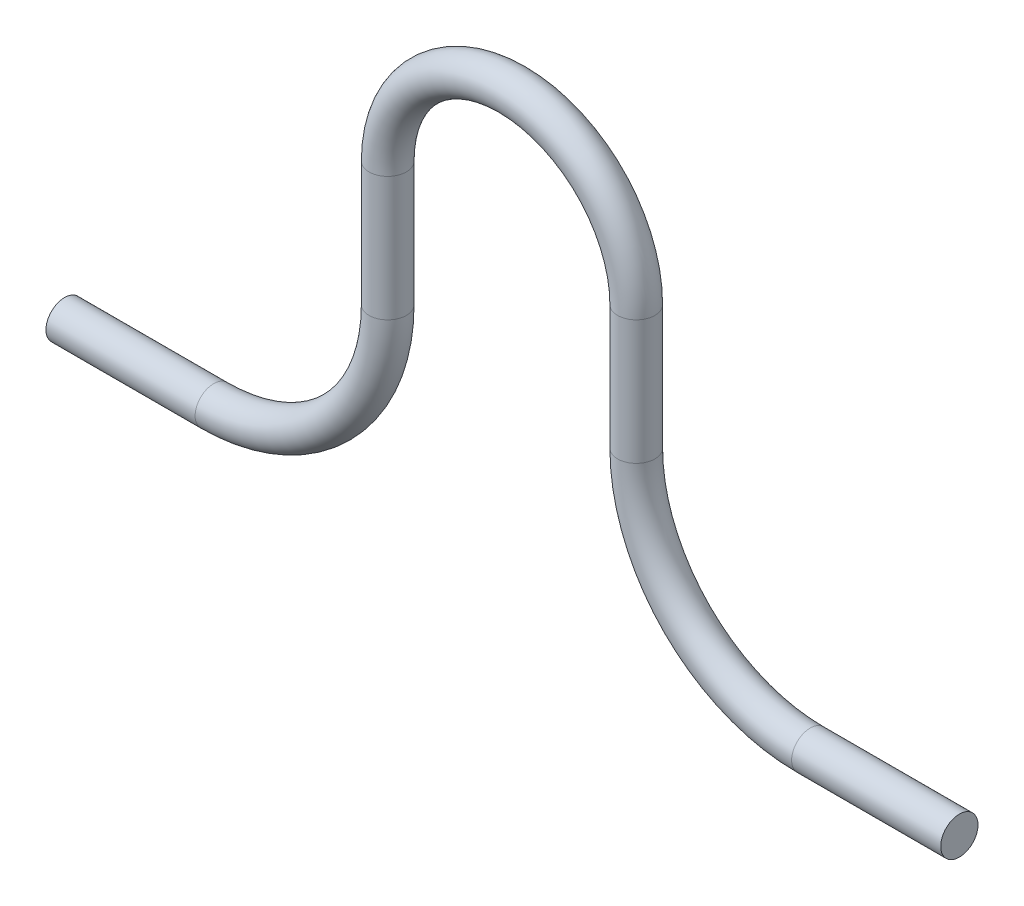
ISO-10303-21;
HEADER;
FILE_DESCRIPTION(('STEP AP214'),'2;1');
FILE_NAME('part.step','',(''),(''),'','','');
FILE_SCHEMA(('AUTOMOTIVE_DESIGN { 1 0 10303 214 1 1 1 1 }'));
ENDSEC;
DATA;
#1=APPLICATION_CONTEXT('core data for automotive mechanical design processes');
#2=APPLICATION_PROTOCOL_DEFINITION('international standard','automotive_design',2000,#1);
#3=PRODUCT_CONTEXT('',#1,'mechanical');
#4=PRODUCT('Part','Part','',(#3));
#5=PRODUCT_RELATED_PRODUCT_CATEGORY('part','',(#4));
#6=PRODUCT_DEFINITION_FORMATION('','',#4);
#7=PRODUCT_DEFINITION_CONTEXT('part definition',#1,'design');
#8=PRODUCT_DEFINITION('design','',#6,#7);
#9=PRODUCT_DEFINITION_SHAPE('','',#8);
#10=(LENGTH_UNIT() NAMED_UNIT(*) SI_UNIT(.MILLI.,.METRE.));
#11=(NAMED_UNIT(*) PLANE_ANGLE_UNIT() SI_UNIT($,.RADIAN.));
#12=(NAMED_UNIT(*) SI_UNIT($,.STERADIAN.) SOLID_ANGLE_UNIT());
#13=UNCERTAINTY_MEASURE_WITH_UNIT(LENGTH_MEASURE(1.E-05),#10,'distance_accuracy_value','');
#14=(GEOMETRIC_REPRESENTATION_CONTEXT(3) GLOBAL_UNCERTAINTY_ASSIGNED_CONTEXT((#13)) GLOBAL_UNIT_ASSIGNED_CONTEXT((#10,
#11,#12)) REPRESENTATION_CONTEXT('',''));
#15=CARTESIAN_POINT('',(0.,0.,0.));
#16=DIRECTION('',(0.,0.,1.));
#17=DIRECTION('',(1.,0.,0.));
#18=AXIS2_PLACEMENT_3D('',#15,#16,#17);
#19=CARTESIAN_POINT('',(-180.,-170.,0.));
#20=DIRECTION('',(1.,0.,0.));
#21=DIRECTION('',(0.,0.,-1.));
#22=AXIS2_PLACEMENT_3D('',#19,#20,#21);
#23=PLANE('',#22);
#24=CARTESIAN_POINT('',(-180.,-170.,0.));
#25=DIRECTION('',(1.,0.,0.));
#26=DIRECTION('',(0.,0.,-1.));
#27=AXIS2_PLACEMENT_3D('',#24,#25,#26);
#28=CIRCLE('',#27,7.5);
#29=CARTESIAN_POINT('',(-180.,-170.,-7.5));
#30=VERTEX_POINT('',#29);
#31=EDGE_CURVE('E60',#30,#30,#28,.T.);
#32=ORIENTED_EDGE('',*,*,#31,.F.);
#33=EDGE_LOOP('',(#32));
#34=FACE_BOUND('',#33,.T.);
#35=ADVANCED_FACE('F48',(#34),#23,.F.);
#36=CARTESIAN_POINT('',(-180.,-170.,0.));
#37=DIRECTION('',(1.,0.,0.));
#38=DIRECTION('',(0.,1.,0.));
#39=AXIS2_PLACEMENT_3D('',#36,#37,#38);
#40=CYLINDRICAL_SURFACE('',#39,7.5);
#41=CARTESIAN_POINT('',(-120.,-170.,0.));
#42=DIRECTION('',(1.,0.,0.));
#43=DIRECTION('',(0.,0.,-1.));
#44=AXIS2_PLACEMENT_3D('',#41,#42,#43);
#45=CIRCLE('',#44,7.5);
#46=CARTESIAN_POINT('',(-120.,-177.5,0.));
#47=VERTEX_POINT('',#46);
#48=EDGE_CURVE('E79',#47,#47,#45,.T.);
#49=ORIENTED_EDGE('',*,*,#48,.F.);
#50=EDGE_LOOP('',(#49));
#51=FACE_BOUND('',#50,.T.);
#52=ORIENTED_EDGE('',*,*,#31,.T.);
#53=EDGE_LOOP('',(#52));
#54=FACE_BOUND('',#53,.T.);
#55=ADVANCED_FACE('F89',(#51,#54),#40,.T.);
#56=CARTESIAN_POINT('',(-120.,-100.,0.));
#57=DIRECTION('',(0.,0.,1.));
#58=DIRECTION('',(1.,0.,0.));
#59=AXIS2_PLACEMENT_3D('',#56,#57,#58);
#60=TOROIDAL_SURFACE('',#59,70.,7.5);
#61=CARTESIAN_POINT('',(-50.,-100.,0.));
#62=DIRECTION('',(0.,1.,0.));
#63=DIRECTION('',(0.,0.,-1.));
#64=AXIS2_PLACEMENT_3D('',#61,#62,#63);
#65=CIRCLE('',#64,7.5);
#66=CARTESIAN_POINT('',(-42.5,-100.,0.));
#67=VERTEX_POINT('',#66);
#68=EDGE_CURVE('E55',#67,#67,#65,.T.);
#69=CARTESIAN_POINT('',(-120.,-100.,0.));
#70=DIRECTION('',(0.,0.,1.));
#71=DIRECTION('',(1.,0.,0.));
#72=AXIS2_PLACEMENT_3D('',#69,#70,#71);
#73=CIRCLE('',#72,77.5);
#74=EDGE_CURVE('',#47,#67,#73,.T.);
#75=ORIENTED_EDGE('',*,*,#48,.T.);
#76=ORIENTED_EDGE('',*,*,#68,.F.);
#77=ORIENTED_EDGE('',*,*,#74,.T.);
#78=ORIENTED_EDGE('',*,*,#74,.F.);
#79=EDGE_LOOP('',(#75,#77,#76,#78));
#80=FACE_BOUND('',#79,.T.);
#81=ADVANCED_FACE('F86',(#80),#60,.T.);
#82=CARTESIAN_POINT('',(-50.,-100.,0.));
#83=DIRECTION('',(0.,1.,0.));
#84=DIRECTION('',(-1.,0.,0.));
#85=AXIS2_PLACEMENT_3D('',#82,#83,#84);
#86=CYLINDRICAL_SURFACE('',#85,7.5);
#87=CARTESIAN_POINT('',(-50.,-50.,0.));
#88=DIRECTION('',(0.,1.,0.));
#89=DIRECTION('',(0.,0.,-1.));
#90=AXIS2_PLACEMENT_3D('',#87,#88,#89);
#91=CIRCLE('',#90,7.5);
#92=CARTESIAN_POINT('',(-57.5,-50.,0.));
#93=VERTEX_POINT('',#92);
#94=EDGE_CURVE('E13',#93,#93,#91,.T.);
#95=ORIENTED_EDGE('',*,*,#94,.F.);
#96=EDGE_LOOP('',(#95));
#97=FACE_BOUND('',#96,.T.);
#98=ORIENTED_EDGE('',*,*,#68,.T.);
#99=EDGE_LOOP('',(#98));
#100=FACE_BOUND('',#99,.T.);
#101=ADVANCED_FACE('F84',(#97,#100),#86,.T.);
#102=CARTESIAN_POINT('',(0.,-50.,0.));
#103=DIRECTION('',(0.,0.,-1.));
#104=DIRECTION('',(-1.,0.,0.));
#105=AXIS2_PLACEMENT_3D('',#102,#103,#104);
#106=TOROIDAL_SURFACE('',#105,50.,7.5);
#107=CARTESIAN_POINT('',(50.,-50.,0.));
#108=DIRECTION('',(0.,-1.,0.));
#109=DIRECTION('',(0.,0.,-1.));
#110=AXIS2_PLACEMENT_3D('',#107,#108,#109);
#111=CIRCLE('',#110,7.5);
#112=CARTESIAN_POINT('',(57.5,-50.,0.));
#113=VERTEX_POINT('',#112);
#114=EDGE_CURVE('E75',#113,#113,#111,.T.);
#115=CARTESIAN_POINT('',(0.,-50.,0.));
#116=DIRECTION('',(0.,0.,-1.));
#117=DIRECTION('',(-1.,0.,0.));
#118=AXIS2_PLACEMENT_3D('',#115,#116,#117);
#119=CIRCLE('',#118,57.5);
#120=EDGE_CURVE('',#93,#113,#119,.T.);
#121=ORIENTED_EDGE('',*,*,#94,.T.);
#122=ORIENTED_EDGE('',*,*,#114,.F.);
#123=ORIENTED_EDGE('',*,*,#120,.T.);
#124=ORIENTED_EDGE('',*,*,#120,.F.);
#125=EDGE_LOOP('',(#121,#123,#122,#124));
#126=FACE_BOUND('',#125,.T.);
#127=ADVANCED_FACE('F100',(#126),#106,.T.);
#128=CARTESIAN_POINT('',(180.,-170.,0.));
#129=DIRECTION('',(-1.,0.,0.));
#130=DIRECTION('',(0.,0.,-1.));
#131=AXIS2_PLACEMENT_3D('',#128,#129,#130);
#132=PLANE('',#131);
#133=CARTESIAN_POINT('',(180.,-170.,0.));
#134=DIRECTION('',(1.,0.,0.));
#135=DIRECTION('',(0.,0.,-1.));
#136=AXIS2_PLACEMENT_3D('',#133,#134,#135);
#137=CIRCLE('',#136,7.5);
#138=CARTESIAN_POINT('',(180.,-170.,-7.5));
#139=VERTEX_POINT('',#138);
#140=EDGE_CURVE('E64',#139,#139,#137,.T.);
#141=ORIENTED_EDGE('',*,*,#140,.T.);
#142=EDGE_LOOP('',(#141));
#143=FACE_BOUND('',#142,.T.);
#144=ADVANCED_FACE('F65',(#143),#132,.F.);
#145=CARTESIAN_POINT('',(180.,-170.,0.));
#146=DIRECTION('',(-1.,0.,0.));
#147=DIRECTION('',(0.,1.,0.));
#148=AXIS2_PLACEMENT_3D('',#145,#146,#147);
#149=CYLINDRICAL_SURFACE('',#148,7.5);
#150=CARTESIAN_POINT('',(120.,-170.,0.));
#151=DIRECTION('',(1.,0.,0.));
#152=DIRECTION('',(0.,0.,-1.));
#153=AXIS2_PLACEMENT_3D('',#150,#151,#152);
#154=CIRCLE('',#153,7.5);
#155=CARTESIAN_POINT('',(120.,-177.5,0.));
#156=VERTEX_POINT('',#155);
#157=EDGE_CURVE('E67',#156,#156,#154,.T.);
#158=ORIENTED_EDGE('',*,*,#157,.T.);
#159=EDGE_LOOP('',(#158));
#160=FACE_BOUND('',#159,.T.);
#161=ORIENTED_EDGE('',*,*,#140,.F.);
#162=EDGE_LOOP('',(#161));
#163=FACE_BOUND('',#162,.T.);
#164=ADVANCED_FACE('F107',(#160,#163),#149,.T.);
#165=CARTESIAN_POINT('',(120.,-100.,0.));
#166=DIRECTION('',(0.,0.,1.));
#167=DIRECTION('',(-1.,0.,0.));
#168=AXIS2_PLACEMENT_3D('',#165,#166,#167);
#169=TOROIDAL_SURFACE('',#168,70.,7.5);
#170=CARTESIAN_POINT('',(50.,-100.,0.));
#171=DIRECTION('',(0.,-1.,0.));
#172=DIRECTION('',(0.,0.,-1.));
#173=AXIS2_PLACEMENT_3D('',#170,#171,#172);
#174=CIRCLE('',#173,7.5);
#175=CARTESIAN_POINT('',(42.5,-100.,0.));
#176=VERTEX_POINT('',#175);
#177=EDGE_CURVE('E70',#176,#176,#174,.T.);
#178=CARTESIAN_POINT('',(120.,-100.,0.));
#179=DIRECTION('',(0.,0.,1.));
#180=DIRECTION('',(-1.,0.,0.));
#181=AXIS2_PLACEMENT_3D('',#178,#179,#180);
#182=CIRCLE('',#181,77.5);
#183=EDGE_CURVE('',#176,#156,#182,.T.);
#184=ORIENTED_EDGE('',*,*,#177,.T.);
#185=ORIENTED_EDGE('',*,*,#157,.F.);
#186=ORIENTED_EDGE('',*,*,#183,.T.);
#187=ORIENTED_EDGE('',*,*,#183,.F.);
#188=EDGE_LOOP('',(#184,#186,#185,#187));
#189=FACE_BOUND('',#188,.T.);
#190=ADVANCED_FACE('F117',(#189),#169,.T.);
#191=CARTESIAN_POINT('',(50.,-100.,0.));
#192=DIRECTION('',(0.,1.,0.));
#193=DIRECTION('',(1.,0.,0.));
#194=AXIS2_PLACEMENT_3D('',#191,#192,#193);
#195=CYLINDRICAL_SURFACE('',#194,7.5);
#196=ORIENTED_EDGE('',*,*,#114,.T.);
#197=EDGE_LOOP('',(#196));
#198=FACE_BOUND('',#197,.T.);
#199=ORIENTED_EDGE('',*,*,#177,.F.);
#200=EDGE_LOOP('',(#199));
#201=FACE_BOUND('',#200,.T.);
#202=ADVANCED_FACE('F114',(#198,#201),#195,.T.);
#203=CLOSED_SHELL('',(#35,#55,#81,#101,#127,#144,#164,#190,#202));
#204=MANIFOLD_SOLID_BREP('B2',#203);
#205=ADVANCED_BREP_SHAPE_REPRESENTATION('',(#18,#204),#14);
#206=SHAPE_DEFINITION_REPRESENTATION(#9,#205);
ENDSEC;
END-ISO-10303-21;
